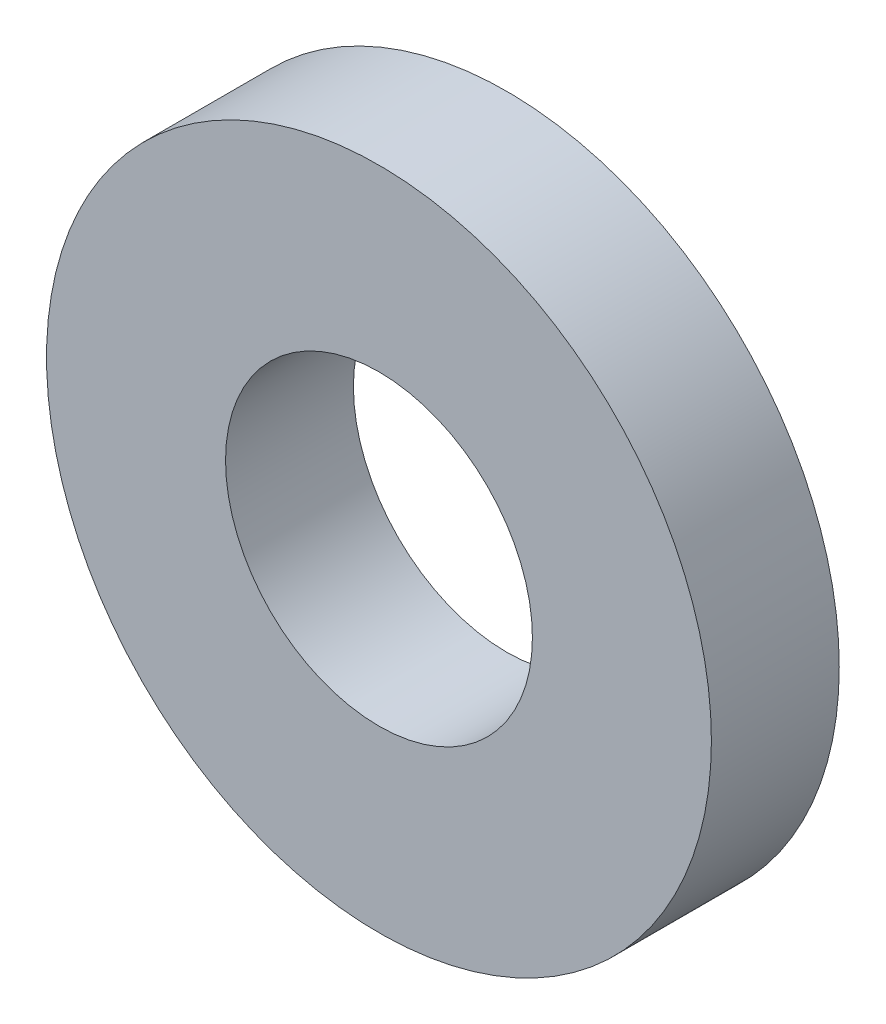
ISO-10303-21;
HEADER;
FILE_DESCRIPTION(('STEP AP214'),'2;1');
FILE_NAME('part.step','',(''),(''),'','','');
FILE_SCHEMA(('AUTOMOTIVE_DESIGN { 1 0 10303 214 1 1 1 1 }'));
ENDSEC;
DATA;
#1=APPLICATION_CONTEXT('core data for automotive mechanical design processes');
#2=APPLICATION_PROTOCOL_DEFINITION('international standard','automotive_design',2000,#1);
#3=PRODUCT_CONTEXT('',#1,'mechanical');
#4=PRODUCT('Part','Part','',(#3));
#5=PRODUCT_RELATED_PRODUCT_CATEGORY('part','',(#4));
#6=PRODUCT_DEFINITION_FORMATION('','',#4);
#7=PRODUCT_DEFINITION_CONTEXT('part definition',#1,'design');
#8=PRODUCT_DEFINITION('design','',#6,#7);
#9=PRODUCT_DEFINITION_SHAPE('','',#8);
#10=(LENGTH_UNIT() NAMED_UNIT(*) SI_UNIT(.MILLI.,.METRE.));
#11=(NAMED_UNIT(*) PLANE_ANGLE_UNIT() SI_UNIT($,.RADIAN.));
#12=(NAMED_UNIT(*) SI_UNIT($,.STERADIAN.) SOLID_ANGLE_UNIT());
#13=UNCERTAINTY_MEASURE_WITH_UNIT(LENGTH_MEASURE(1.E-05),#10,'distance_accuracy_value','');
#14=(GEOMETRIC_REPRESENTATION_CONTEXT(3) GLOBAL_UNCERTAINTY_ASSIGNED_CONTEXT((#13)) GLOBAL_UNIT_ASSIGNED_CONTEXT((#10,
#11,#12)) REPRESENTATION_CONTEXT('',''));
#15=CARTESIAN_POINT('',(0.,0.,0.));
#16=DIRECTION('',(0.,0.,1.));
#17=DIRECTION('',(1.,0.,0.));
#18=AXIS2_PLACEMENT_3D('',#15,#16,#17);
#19=CARTESIAN_POINT('',(0.,0.,2.5));
#20=DIRECTION('',(0.,0.,1.));
#21=DIRECTION('',(1.,0.,0.));
#22=AXIS2_PLACEMENT_3D('',#19,#20,#21);
#23=PLANE('',#22);
#24=CARTESIAN_POINT('',(0.,0.,2.5));
#25=DIRECTION('',(0.,0.,1.));
#26=DIRECTION('',(1.,0.,0.));
#27=AXIS2_PLACEMENT_3D('',#24,#25,#26);
#28=CIRCLE('',#27,6.5);
#29=CARTESIAN_POINT('',(6.5,0.,2.5));
#30=VERTEX_POINT('',#29);
#31=EDGE_CURVE('E10',#30,#30,#28,.T.);
#32=ORIENTED_EDGE('',*,*,#31,.T.);
#33=EDGE_LOOP('',(#32));
#34=FACE_BOUND('',#33,.T.);
#35=CARTESIAN_POINT('',(0.,0.,2.5));
#36=DIRECTION('',(0.,0.,1.));
#37=DIRECTION('',(1.,0.,0.));
#38=AXIS2_PLACEMENT_3D('',#35,#36,#37);
#39=CIRCLE('',#38,3.);
#40=CARTESIAN_POINT('',(3.,0.,2.5));
#41=VERTEX_POINT('',#40);
#42=EDGE_CURVE('E49',#41,#41,#39,.T.);
#43=ORIENTED_EDGE('',*,*,#42,.F.);
#44=EDGE_LOOP('',(#43));
#45=FACE_BOUND('',#44,.T.);
#46=ADVANCED_FACE('F38',(#34,#45),#23,.T.);
#47=CARTESIAN_POINT('',(0.,0.,0.));
#48=DIRECTION('',(0.,0.,1.));
#49=DIRECTION('',(1.,0.,0.));
#50=AXIS2_PLACEMENT_3D('',#47,#48,#49);
#51=PLANE('',#50);
#52=CARTESIAN_POINT('',(0.,0.,0.));
#53=DIRECTION('',(0.,0.,1.));
#54=DIRECTION('',(1.,0.,0.));
#55=AXIS2_PLACEMENT_3D('',#52,#53,#54);
#56=CIRCLE('',#55,6.5);
#57=CARTESIAN_POINT('',(6.5,0.,0.));
#58=VERTEX_POINT('',#57);
#59=EDGE_CURVE('E42',#58,#58,#56,.T.);
#60=ORIENTED_EDGE('',*,*,#59,.F.);
#61=EDGE_LOOP('',(#60));
#62=FACE_BOUND('',#61,.T.);
#63=CARTESIAN_POINT('',(0.,0.,0.));
#64=DIRECTION('',(0.,0.,1.));
#65=DIRECTION('',(1.,0.,0.));
#66=AXIS2_PLACEMENT_3D('',#63,#64,#65);
#67=CIRCLE('',#66,3.);
#68=CARTESIAN_POINT('',(3.,0.,0.));
#69=VERTEX_POINT('',#68);
#70=EDGE_CURVE('E51',#69,#69,#67,.T.);
#71=ORIENTED_EDGE('',*,*,#70,.T.);
#72=EDGE_LOOP('',(#71));
#73=FACE_BOUND('',#72,.T.);
#74=ADVANCED_FACE('F61',(#62,#73),#51,.F.);
#75=CARTESIAN_POINT('',(0.,0.,2.5));
#76=DIRECTION('',(0.,0.,-1.));
#77=DIRECTION('',(-1.,0.,0.));
#78=AXIS2_PLACEMENT_3D('',#75,#76,#77);
#79=CYLINDRICAL_SURFACE('',#78,6.5);
#80=ORIENTED_EDGE('',*,*,#31,.F.);
#81=EDGE_LOOP('',(#80));
#82=FACE_BOUND('',#81,.T.);
#83=ORIENTED_EDGE('',*,*,#59,.T.);
#84=EDGE_LOOP('',(#83));
#85=FACE_BOUND('',#84,.T.);
#86=ADVANCED_FACE('F40',(#82,#85),#79,.T.);
#87=CARTESIAN_POINT('',(0.,0.,2.5));
#88=DIRECTION('',(0.,0.,-1.));
#89=DIRECTION('',(-1.,0.,0.));
#90=AXIS2_PLACEMENT_3D('',#87,#88,#89);
#91=CYLINDRICAL_SURFACE('',#90,3.);
#92=ORIENTED_EDGE('',*,*,#42,.T.);
#93=EDGE_LOOP('',(#92));
#94=FACE_BOUND('',#93,.T.);
#95=ORIENTED_EDGE('',*,*,#70,.F.);
#96=EDGE_LOOP('',(#95));
#97=FACE_BOUND('',#96,.T.);
#98=ADVANCED_FACE('F57',(#94,#97),#91,.F.);
#99=CLOSED_SHELL('',(#46,#74,#86,#98));
#100=MANIFOLD_SOLID_BREP('B2',#99);
#101=ADVANCED_BREP_SHAPE_REPRESENTATION('',(#18,#100),#14);
#102=SHAPE_DEFINITION_REPRESENTATION(#9,#101);
ENDSEC;
END-ISO-10303-21;
